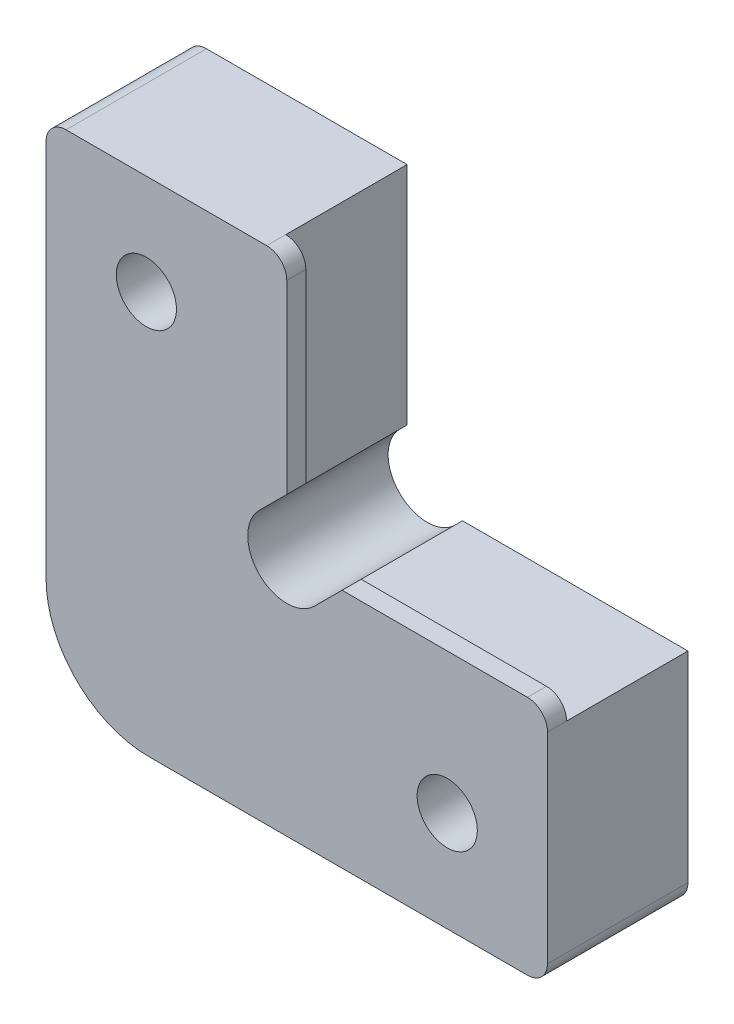
ISO-10303-21;
HEADER;
FILE_DESCRIPTION(('STEP AP214'),'2;1');
FILE_NAME('part.step','',(''),(''),'','','');
FILE_SCHEMA(('AUTOMOTIVE_DESIGN { 1 0 10303 214 1 1 1 1 }'));
ENDSEC;
DATA;
#1=APPLICATION_CONTEXT('core data for automotive mechanical design processes');
#2=APPLICATION_PROTOCOL_DEFINITION('international standard','automotive_design',2000,#1);
#3=PRODUCT_CONTEXT('',#1,'mechanical');
#4=PRODUCT('Part','Part','',(#3));
#5=PRODUCT_RELATED_PRODUCT_CATEGORY('part','',(#4));
#6=PRODUCT_DEFINITION_FORMATION('','',#4);
#7=PRODUCT_DEFINITION_CONTEXT('part definition',#1,'design');
#8=PRODUCT_DEFINITION('design','',#6,#7);
#9=PRODUCT_DEFINITION_SHAPE('','',#8);
#10=(LENGTH_UNIT() NAMED_UNIT(*) SI_UNIT(.MILLI.,.METRE.));
#11=(NAMED_UNIT(*) PLANE_ANGLE_UNIT() SI_UNIT($,.RADIAN.));
#12=(NAMED_UNIT(*) SI_UNIT($,.STERADIAN.) SOLID_ANGLE_UNIT());
#13=UNCERTAINTY_MEASURE_WITH_UNIT(LENGTH_MEASURE(1.E-05),#10,'distance_accuracy_value','');
#14=(GEOMETRIC_REPRESENTATION_CONTEXT(3) GLOBAL_UNCERTAINTY_ASSIGNED_CONTEXT((#13)) GLOBAL_UNIT_ASSIGNED_CONTEXT((#10,
#11,#12)) REPRESENTATION_CONTEXT('',''));
#15=CARTESIAN_POINT('',(0.,0.,0.));
#16=DIRECTION('',(0.,0.,1.));
#17=DIRECTION('',(1.,0.,0.));
#18=AXIS2_PLACEMENT_3D('',#15,#16,#17);
#19=CARTESIAN_POINT('',(14.,0.,7.));
#20=DIRECTION('',(0.,-1.,0.));
#21=DIRECTION('',(1.,0.,0.));
#22=AXIS2_PLACEMENT_3D('',#19,#20,#21);
#23=PLANE('',#22);
#24=DIRECTION('',(1.,0.,0.));
#25=VECTOR('',#24,1.);
#26=CARTESIAN_POINT('',(2.75771644662752,0.,6.05));
#27=LINE('',#26,#25);
#28=CARTESIAN_POINT('',(2.75771644662752,0.,6.05));
#29=VERTEX_POINT('',#28);
#30=CARTESIAN_POINT('',(14.,0.,6.05));
#31=VERTEX_POINT('',#30);
#32=EDGE_CURVE('E358',#29,#31,#27,.T.);
#33=ORIENTED_EDGE('',*,*,#32,.T.);
#34=DIRECTION('',(0.,0.,-1.));
#35=VECTOR('',#34,1.);
#36=CARTESIAN_POINT('',(14.,0.,7.));
#37=LINE('',#36,#35);
#38=CARTESIAN_POINT('',(14.,0.,0.));
#39=VERTEX_POINT('',#38);
#40=EDGE_CURVE('E203',#31,#39,#37,.T.);
#41=ORIENTED_EDGE('',*,*,#40,.T.);
#42=DIRECTION('',(-1.,0.,0.));
#43=VECTOR('',#42,1.);
#44=CARTESIAN_POINT('',(14.,0.,0.));
#45=LINE('',#44,#43);
#46=CARTESIAN_POINT('',(2.75771644662752,0.,0.));
#47=VERTEX_POINT('',#46);
#48=EDGE_CURVE('E253',#39,#47,#45,.T.);
#49=ORIENTED_EDGE('',*,*,#48,.T.);
#50=DIRECTION('',(0.,0.,-1.));
#51=VECTOR('',#50,1.);
#52=CARTESIAN_POINT('',(2.75771644662752,0.,7.));
#53=LINE('',#52,#51);
#54=EDGE_CURVE('E200',#29,#47,#53,.T.);
#55=ORIENTED_EDGE('',*,*,#54,.F.);
#56=EDGE_LOOP('',(#33,#41,#49,#55));
#57=FACE_BOUND('',#56,.T.);
#58=ADVANCED_FACE('F39',(#57),#23,.F.);
#59=CARTESIAN_POINT('',(-10.0037276247078,13.0037276247078,7.));
#60=DIRECTION('',(0.,0.,1.));
#61=DIRECTION('',(1.,0.,0.));
#62=AXIS2_PLACEMENT_3D('',#59,#60,#61);
#63=PLANE('',#62);
#64=CARTESIAN_POINT('',(8.99999999999997,-6.,7.));
#65=DIRECTION('',(0.,0.,1.));
#66=DIRECTION('',(1.,0.,0.));
#67=AXIS2_PLACEMENT_3D('',#64,#65,#66);
#68=CIRCLE('',#67,1.5);
#69=CARTESIAN_POINT('',(10.5,-6.,7.));
#70=VERTEX_POINT('',#69);
#71=EDGE_CURVE('E292',#70,#70,#68,.T.);
#72=ORIENTED_EDGE('',*,*,#71,.F.);
#73=EDGE_LOOP('',(#72));
#74=FACE_BOUND('',#73,.T.);
#75=CARTESIAN_POINT('',(-10.0037276247078,13.0037276247078,7.));
#76=DIRECTION('',(0.,0.,1.));
#77=DIRECTION('',(1.,0.,0.));
#78=AXIS2_PLACEMENT_3D('',#75,#76,#77);
#79=CIRCLE('',#78,0.996272375292206);
#80=CARTESIAN_POINT('',(-10.0037276247078,14.,7.));
#81=VERTEX_POINT('',#80);
#82=CARTESIAN_POINT('',(-11.,13.0037276247078,7.));
#83=VERTEX_POINT('',#82);
#84=EDGE_CURVE('E270',#81,#83,#79,.T.);
#85=ORIENTED_EDGE('',*,*,#84,.T.);
#86=DIRECTION('',(0.,-1.,0.));
#87=VECTOR('',#86,1.);
#88=CARTESIAN_POINT('',(-11.,13.0037276247078,7.));
#89=LINE('',#88,#87);
#90=CARTESIAN_POINT('',(-11.,-5.86775828744859,7.));
#91=VERTEX_POINT('',#90);
#92=EDGE_CURVE('E310',#83,#91,#89,.T.);
#93=ORIENTED_EDGE('',*,*,#92,.T.);
#94=CARTESIAN_POINT('',(-5.86775828744861,-5.86775828744859,7.));
#95=DIRECTION('',(0.,0.,1.));
#96=DIRECTION('',(1.,0.,0.));
#97=AXIS2_PLACEMENT_3D('',#94,#95,#96);
#98=CIRCLE('',#97,5.13224171255141);
#99=CARTESIAN_POINT('',(-5.86775828744861,-11.,7.));
#100=VERTEX_POINT('',#99);
#101=EDGE_CURVE('E227',#91,#100,#98,.T.);
#102=ORIENTED_EDGE('',*,*,#101,.T.);
#103=DIRECTION('',(1.,0.,0.));
#104=VECTOR('',#103,1.);
#105=CARTESIAN_POINT('',(-5.86775828744861,-11.,7.));
#106=LINE('',#105,#104);
#107=CARTESIAN_POINT('',(13.0037276247078,-11.,7.));
#108=VERTEX_POINT('',#107);
#109=EDGE_CURVE('E315',#100,#108,#106,.T.);
#110=ORIENTED_EDGE('',*,*,#109,.T.);
#111=CARTESIAN_POINT('',(13.0037276247078,-10.0037276247079,7.));
#112=DIRECTION('',(0.,0.,1.));
#113=DIRECTION('',(1.,0.,0.));
#114=AXIS2_PLACEMENT_3D('',#111,#112,#113);
#115=CIRCLE('',#114,0.996272375292165);
#116=CARTESIAN_POINT('',(13.9999999999999,-10.0037276247079,7.));
#117=VERTEX_POINT('',#116);
#118=EDGE_CURVE('E318',#108,#117,#115,.T.);
#119=ORIENTED_EDGE('',*,*,#118,.T.);
#120=DIRECTION('',(0.,1.,0.));
#121=VECTOR('',#120,1.);
#122=CARTESIAN_POINT('',(13.9999999999999,-10.0037276247079,7.));
#123=LINE('',#122,#121);
#124=CARTESIAN_POINT('',(14.,0.,7.));
#125=VERTEX_POINT('',#124);
#126=EDGE_CURVE('E321',#117,#125,#123,.T.);
#127=ORIENTED_EDGE('',*,*,#126,.T.);
#128=CARTESIAN_POINT('',(13.,0.,7.));
#129=DIRECTION('',(0.,0.,1.));
#130=DIRECTION('',(1.,0.,0.));
#131=AXIS2_PLACEMENT_3D('',#128,#129,#130);
#132=CIRCLE('',#131,0.999999999999992);
#133=CARTESIAN_POINT('',(13.,0.99999999999999,7.));
#134=VERTEX_POINT('',#133);
#135=EDGE_CURVE('E356',#125,#134,#132,.T.);
#136=ORIENTED_EDGE('',*,*,#135,.T.);
#137=DIRECTION('',(-1.,0.,0.));
#138=VECTOR('',#137,1.);
#139=CARTESIAN_POINT('',(3.75771644662751,0.999999999999989,7.));
#140=LINE('',#139,#138);
#141=CARTESIAN_POINT('',(3.75771644662751,0.999999999999989,7.));
#142=VERTEX_POINT('',#141);
#143=EDGE_CURVE('E363',#134,#142,#140,.T.);
#144=ORIENTED_EDGE('',*,*,#143,.T.);
#145=DIRECTION('',(-0.707106781186558,-0.707106781186538,0.));
#146=VECTOR('',#145,1.);
#147=CARTESIAN_POINT('',(2.38259271885182,-0.375123727775688,7.));
#148=LINE('',#147,#146);
#149=CARTESIAN_POINT('',(2.38259271885182,-0.375123727775688,7.));
#150=VERTEX_POINT('',#149);
#151=EDGE_CURVE('E325',#142,#150,#148,.T.);
#152=ORIENTED_EDGE('',*,*,#151,.T.);
#153=CARTESIAN_POINT('',(1.00373449553806,1.00373449553808,7.));
#154=DIRECTION('',(0.,0.,-1.));
#155=DIRECTION('',(1.,0.,0.));
#156=AXIS2_PLACEMENT_3D('',#153,#154,#155);
#157=CIRCLE('',#156,1.95);
#158=CARTESIAN_POINT('',(-0.375123727775707,2.38259271885185,7.));
#159=VERTEX_POINT('',#158);
#160=EDGE_CURVE('E288',#150,#159,#157,.T.);
#161=ORIENTED_EDGE('',*,*,#160,.T.);
#162=DIRECTION('',(0.707106781186557,0.707106781186538,0.));
#163=VECTOR('',#162,1.);
#164=CARTESIAN_POINT('',(0.,2.75771644662755,7.));
#165=LINE('',#164,#163);
#166=CARTESIAN_POINT('',(0.999999999999987,3.75771644662754,7.));
#167=VERTEX_POINT('',#166);
#168=EDGE_CURVE('E281',#159,#167,#165,.T.);
#169=ORIENTED_EDGE('',*,*,#168,.T.);
#170=DIRECTION('',(0.,1.,0.));
#171=VECTOR('',#170,1.);
#172=CARTESIAN_POINT('',(0.999999999999987,3.75771644662754,7.));
#173=LINE('',#172,#171);
#174=CARTESIAN_POINT('',(0.999999999999987,13.,7.));
#175=VERTEX_POINT('',#174);
#176=EDGE_CURVE('E345',#167,#175,#173,.T.);
#177=ORIENTED_EDGE('',*,*,#176,.T.);
#178=CARTESIAN_POINT('',(0.,13.,7.));
#179=DIRECTION('',(0.,0.,1.));
#180=DIRECTION('',(-1.,0.,0.));
#181=AXIS2_PLACEMENT_3D('',#178,#179,#180);
#182=CIRCLE('',#181,0.999999999999987);
#183=CARTESIAN_POINT('',(0.,14.,7.));
#184=VERTEX_POINT('',#183);
#185=EDGE_CURVE('E179',#175,#184,#182,.T.);
#186=ORIENTED_EDGE('',*,*,#185,.T.);
#187=DIRECTION('',(-1.,0.,0.));
#188=VECTOR('',#187,1.);
#189=CARTESIAN_POINT('',(-10.0037276247078,14.,7.));
#190=LINE('',#189,#188);
#191=EDGE_CURVE('E274',#184,#81,#190,.T.);
#192=ORIENTED_EDGE('',*,*,#191,.T.);
#193=EDGE_LOOP('',(#85,#93,#102,#110,#119,#127,#136,#144,#152,#161,#169,#177,#186,#192));
#194=FACE_BOUND('',#193,.T.);
#195=CARTESIAN_POINT('',(-6.00000000000001,9.,7.));
#196=DIRECTION('',(0.,0.,1.));
#197=DIRECTION('',(1.,0.,0.));
#198=AXIS2_PLACEMENT_3D('',#195,#196,#197);
#199=CIRCLE('',#198,1.5);
#200=CARTESIAN_POINT('',(-4.50000000000001,9.,7.));
#201=VERTEX_POINT('',#200);
#202=EDGE_CURVE('E302',#201,#201,#199,.T.);
#203=ORIENTED_EDGE('',*,*,#202,.F.);
#204=EDGE_LOOP('',(#203));
#205=FACE_BOUND('',#204,.T.);
#206=ADVANCED_FACE('F330',(#74,#194,#205),#63,.T.);
#207=CARTESIAN_POINT('',(-10.0037276247078,13.0037276247078,0.));
#208=DIRECTION('',(0.,0.,1.));
#209=DIRECTION('',(1.,0.,0.));
#210=AXIS2_PLACEMENT_3D('',#207,#208,#209);
#211=PLANE('',#210);
#212=CARTESIAN_POINT('',(-10.0037276247078,13.0037276247078,0.));
#213=DIRECTION('',(0.,0.,1.));
#214=DIRECTION('',(1.,0.,0.));
#215=AXIS2_PLACEMENT_3D('',#212,#213,#214);
#216=CIRCLE('',#215,0.996272375292206);
#217=CARTESIAN_POINT('',(-10.0037276247078,14.,0.));
#218=VERTEX_POINT('',#217);
#219=CARTESIAN_POINT('',(-11.,13.0037276247078,0.));
#220=VERTEX_POINT('',#219);
#221=EDGE_CURVE('E243',#218,#220,#216,.T.);
#222=ORIENTED_EDGE('',*,*,#221,.F.);
#223=DIRECTION('',(-1.,0.,0.));
#224=VECTOR('',#223,1.);
#225=CARTESIAN_POINT('',(-10.0037276247078,14.,0.));
#226=LINE('',#225,#224);
#227=CARTESIAN_POINT('',(0.,14.,0.));
#228=VERTEX_POINT('',#227);
#229=EDGE_CURVE('E268',#228,#218,#226,.T.);
#230=ORIENTED_EDGE('',*,*,#229,.F.);
#231=DIRECTION('',(0.,1.,0.));
#232=VECTOR('',#231,1.);
#233=CARTESIAN_POINT('',(0.,2.75771644662755,0.));
#234=LINE('',#233,#232);
#235=CARTESIAN_POINT('',(0.,2.75771644662755,0.));
#236=VERTEX_POINT('',#235);
#237=EDGE_CURVE('E265',#236,#228,#234,.T.);
#238=ORIENTED_EDGE('',*,*,#237,.F.);
#239=DIRECTION('',(0.707106781186557,0.707106781186538,0.));
#240=VECTOR('',#239,1.);
#241=CARTESIAN_POINT('',(0.,2.75771644662755,0.));
#242=LINE('',#241,#240);
#243=CARTESIAN_POINT('',(-0.375123727775707,2.38259271885185,0.));
#244=VERTEX_POINT('',#243);
#245=EDGE_CURVE('E184',#244,#236,#242,.T.);
#246=ORIENTED_EDGE('',*,*,#245,.F.);
#247=CARTESIAN_POINT('',(1.00373449553806,1.00373449553808,0.));
#248=DIRECTION('',(0.,0.,-1.));
#249=DIRECTION('',(1.,0.,0.));
#250=AXIS2_PLACEMENT_3D('',#247,#248,#249);
#251=CIRCLE('',#250,1.95);
#252=CARTESIAN_POINT('',(2.38259271885182,-0.375123727775688,0.));
#253=VERTEX_POINT('',#252);
#254=EDGE_CURVE('E260',#253,#244,#251,.T.);
#255=ORIENTED_EDGE('',*,*,#254,.F.);
#256=DIRECTION('',(-0.707106781186558,-0.707106781186538,0.));
#257=VECTOR('',#256,1.);
#258=CARTESIAN_POINT('',(2.38259271885182,-0.375123727775688,0.));
#259=LINE('',#258,#257);
#260=EDGE_CURVE('E257',#47,#253,#259,.T.);
#261=ORIENTED_EDGE('',*,*,#260,.F.);
#262=ORIENTED_EDGE('',*,*,#48,.F.);
#263=DIRECTION('',(0.,1.,0.));
#264=VECTOR('',#263,1.);
#265=CARTESIAN_POINT('',(13.9999999999999,-10.0037276247079,0.));
#266=LINE('',#265,#264);
#267=CARTESIAN_POINT('',(13.9999999999999,-10.0037276247079,0.));
#268=VERTEX_POINT('',#267);
#269=EDGE_CURVE('E249',#268,#39,#266,.T.);
#270=ORIENTED_EDGE('',*,*,#269,.F.);
#271=CARTESIAN_POINT('',(13.0037276247078,-10.0037276247079,0.));
#272=DIRECTION('',(0.,0.,1.));
#273=DIRECTION('',(1.,0.,0.));
#274=AXIS2_PLACEMENT_3D('',#271,#272,#273);
#275=CIRCLE('',#274,0.996272375292165);
#276=CARTESIAN_POINT('',(13.0037276247078,-11.,0.));
#277=VERTEX_POINT('',#276);
#278=EDGE_CURVE('E241',#277,#268,#275,.T.);
#279=ORIENTED_EDGE('',*,*,#278,.F.);
#280=DIRECTION('',(1.,0.,0.));
#281=VECTOR('',#280,1.);
#282=CARTESIAN_POINT('',(-5.86775828744861,-11.,0.));
#283=LINE('',#282,#281);
#284=CARTESIAN_POINT('',(-5.86775828744861,-11.,0.));
#285=VERTEX_POINT('',#284);
#286=EDGE_CURVE('E236',#285,#277,#283,.T.);
#287=ORIENTED_EDGE('',*,*,#286,.F.);
#288=CARTESIAN_POINT('',(-5.86775828744861,-5.86775828744859,0.));
#289=DIRECTION('',(0.,0.,1.));
#290=DIRECTION('',(1.,0.,0.));
#291=AXIS2_PLACEMENT_3D('',#288,#289,#290);
#292=CIRCLE('',#291,5.13224171255141);
#293=CARTESIAN_POINT('',(-11.,-5.86775828744859,0.));
#294=VERTEX_POINT('',#293);
#295=EDGE_CURVE('E226',#294,#285,#292,.T.);
#296=ORIENTED_EDGE('',*,*,#295,.F.);
#297=DIRECTION('',(0.,-1.,0.));
#298=VECTOR('',#297,1.);
#299=CARTESIAN_POINT('',(-11.,13.0037276247078,0.));
#300=LINE('',#299,#298);
#301=EDGE_CURVE('E234',#220,#294,#300,.T.);
#302=ORIENTED_EDGE('',*,*,#301,.F.);
#303=EDGE_LOOP('',(#222,#230,#238,#246,#255,#261,#262,#270,#279,#287,#296,#302));
#304=FACE_BOUND('',#303,.T.);
#305=CARTESIAN_POINT('',(8.99999999999997,-6.,0.));
#306=DIRECTION('',(0.,0.,1.));
#307=DIRECTION('',(1.,0.,0.));
#308=AXIS2_PLACEMENT_3D('',#305,#306,#307);
#309=CIRCLE('',#308,1.5);
#310=CARTESIAN_POINT('',(10.5,-6.,0.));
#311=VERTEX_POINT('',#310);
#312=EDGE_CURVE('E296',#311,#311,#309,.T.);
#313=ORIENTED_EDGE('',*,*,#312,.T.);
#314=EDGE_LOOP('',(#313));
#315=FACE_BOUND('',#314,.T.);
#316=CARTESIAN_POINT('',(-6.00000000000001,9.,0.));
#317=DIRECTION('',(0.,0.,1.));
#318=DIRECTION('',(1.,0.,0.));
#319=AXIS2_PLACEMENT_3D('',#316,#317,#318);
#320=CIRCLE('',#319,1.5);
#321=CARTESIAN_POINT('',(-4.50000000000001,9.,0.));
#322=VERTEX_POINT('',#321);
#323=EDGE_CURVE('E305',#322,#322,#320,.T.);
#324=ORIENTED_EDGE('',*,*,#323,.T.);
#325=EDGE_LOOP('',(#324));
#326=FACE_BOUND('',#325,.T.);
#327=ADVANCED_FACE('F232',(#304,#315,#326),#211,.F.);
#328=CARTESIAN_POINT('',(-10.0037276247078,13.0037276247078,7.));
#329=DIRECTION('',(0.,0.,-1.));
#330=DIRECTION('',(-1.,0.,0.));
#331=AXIS2_PLACEMENT_3D('',#328,#329,#330);
#332=CYLINDRICAL_SURFACE('',#331,0.996272375292206);
#333=ORIENTED_EDGE('',*,*,#221,.T.);
#334=DIRECTION('',(0.,0.,-1.));
#335=VECTOR('',#334,1.);
#336=CARTESIAN_POINT('',(-11.,13.0037276247078,7.));
#337=LINE('',#336,#335);
#338=EDGE_CURVE('E11',#83,#220,#337,.T.);
#339=ORIENTED_EDGE('',*,*,#338,.F.);
#340=ORIENTED_EDGE('',*,*,#84,.F.);
#341=DIRECTION('',(0.,0.,-1.));
#342=VECTOR('',#341,1.);
#343=CARTESIAN_POINT('',(-10.0037276247078,14.,7.));
#344=LINE('',#343,#342);
#345=EDGE_CURVE('E271',#81,#218,#344,.T.);
#346=ORIENTED_EDGE('',*,*,#345,.T.);
#347=EDGE_LOOP('',(#333,#339,#340,#346));
#348=FACE_BOUND('',#347,.T.);
#349=ADVANCED_FACE('F41',(#348),#332,.T.);
#350=CARTESIAN_POINT('',(-11.,13.0037276247078,7.));
#351=DIRECTION('',(1.,0.,0.));
#352=DIRECTION('',(0.,1.,0.));
#353=AXIS2_PLACEMENT_3D('',#350,#351,#352);
#354=PLANE('',#353);
#355=ORIENTED_EDGE('',*,*,#301,.T.);
#356=DIRECTION('',(0.,0.,-1.));
#357=VECTOR('',#356,1.);
#358=CARTESIAN_POINT('',(-11.,-5.86775828744859,7.));
#359=LINE('',#358,#357);
#360=EDGE_CURVE('E48',#91,#294,#359,.T.);
#361=ORIENTED_EDGE('',*,*,#360,.F.);
#362=ORIENTED_EDGE('',*,*,#92,.F.);
#363=ORIENTED_EDGE('',*,*,#338,.T.);
#364=EDGE_LOOP('',(#355,#361,#362,#363));
#365=FACE_BOUND('',#364,.T.);
#366=ADVANCED_FACE('F433',(#365),#354,.F.);
#367=CARTESIAN_POINT('',(-5.86775828744861,-5.86775828744859,7.));
#368=DIRECTION('',(0.,0.,-1.));
#369=DIRECTION('',(-1.,0.,0.));
#370=AXIS2_PLACEMENT_3D('',#367,#368,#369);
#371=CYLINDRICAL_SURFACE('',#370,5.13224171255141);
#372=ORIENTED_EDGE('',*,*,#295,.T.);
#373=DIRECTION('',(0.,0.,-1.));
#374=VECTOR('',#373,1.);
#375=CARTESIAN_POINT('',(-5.86775828744861,-11.,7.));
#376=LINE('',#375,#374);
#377=EDGE_CURVE('E215',#100,#285,#376,.T.);
#378=ORIENTED_EDGE('',*,*,#377,.F.);
#379=ORIENTED_EDGE('',*,*,#101,.F.);
#380=ORIENTED_EDGE('',*,*,#360,.T.);
#381=EDGE_LOOP('',(#372,#378,#379,#380));
#382=FACE_BOUND('',#381,.T.);
#383=ADVANCED_FACE('F224',(#382),#371,.T.);
#384=CARTESIAN_POINT('',(-5.86775828744861,-11.,7.));
#385=DIRECTION('',(0.,1.,0.));
#386=DIRECTION('',(-1.,0.,0.));
#387=AXIS2_PLACEMENT_3D('',#384,#385,#386);
#388=PLANE('',#387);
#389=ORIENTED_EDGE('',*,*,#286,.T.);
#390=DIRECTION('',(0.,0.,-1.));
#391=VECTOR('',#390,1.);
#392=CARTESIAN_POINT('',(13.0037276247078,-11.,7.));
#393=LINE('',#392,#391);
#394=EDGE_CURVE('E211',#108,#277,#393,.T.);
#395=ORIENTED_EDGE('',*,*,#394,.F.);
#396=ORIENTED_EDGE('',*,*,#109,.F.);
#397=ORIENTED_EDGE('',*,*,#377,.T.);
#398=EDGE_LOOP('',(#389,#395,#396,#397));
#399=FACE_BOUND('',#398,.T.);
#400=ADVANCED_FACE('F427',(#399),#388,.F.);
#401=CARTESIAN_POINT('',(13.0037276247078,-10.0037276247079,7.));
#402=DIRECTION('',(0.,0.,-1.));
#403=DIRECTION('',(-1.,0.,0.));
#404=AXIS2_PLACEMENT_3D('',#401,#402,#403);
#405=CYLINDRICAL_SURFACE('',#404,0.996272375292165);
#406=ORIENTED_EDGE('',*,*,#278,.T.);
#407=DIRECTION('',(0.,0.,-1.));
#408=VECTOR('',#407,1.);
#409=CARTESIAN_POINT('',(13.9999999999999,-10.0037276247079,7.));
#410=LINE('',#409,#408);
#411=EDGE_CURVE('E207',#117,#268,#410,.T.);
#412=ORIENTED_EDGE('',*,*,#411,.F.);
#413=ORIENTED_EDGE('',*,*,#118,.F.);
#414=ORIENTED_EDGE('',*,*,#394,.T.);
#415=EDGE_LOOP('',(#406,#412,#413,#414));
#416=FACE_BOUND('',#415,.T.);
#417=ADVANCED_FACE('F423',(#416),#405,.T.);
#418=CARTESIAN_POINT('',(13.9999999999999,-10.0037276247079,7.));
#419=DIRECTION('',(-1.,0.,0.));
#420=DIRECTION('',(0.,-1.,0.));
#421=AXIS2_PLACEMENT_3D('',#418,#419,#420);
#422=PLANE('',#421);
#423=ORIENTED_EDGE('',*,*,#269,.T.);
#424=ORIENTED_EDGE('',*,*,#40,.F.);
#425=EDGE_CURVE('E204',#125,#31,#37,.T.);
#426=ORIENTED_EDGE('',*,*,#425,.F.);
#427=ORIENTED_EDGE('',*,*,#126,.F.);
#428=ORIENTED_EDGE('',*,*,#411,.T.);
#429=EDGE_LOOP('',(#423,#424,#426,#427,#428));
#430=FACE_BOUND('',#429,.T.);
#431=ADVANCED_FACE('F420',(#430),#422,.F.);
#432=CARTESIAN_POINT('',(2.38259271885182,-0.375123727775688,7.));
#433=DIRECTION('',(0.707106781186538,-0.707106781186558,0.));
#434=DIRECTION('',(0.707106781186558,0.707106781186538,0.));
#435=AXIS2_PLACEMENT_3D('',#432,#433,#434);
#436=PLANE('',#435);
#437=ORIENTED_EDGE('',*,*,#260,.T.);
#438=DIRECTION('',(0.,0.,-1.));
#439=VECTOR('',#438,1.);
#440=CARTESIAN_POINT('',(2.38259271885182,-0.375123727775688,7.));
#441=LINE('',#440,#439);
#442=EDGE_CURVE('E192',#150,#253,#441,.T.);
#443=ORIENTED_EDGE('',*,*,#442,.F.);
#444=ORIENTED_EDGE('',*,*,#151,.F.);
#445=DIRECTION('',(0.,0.,1.));
#446=VECTOR('',#445,1.);
#447=CARTESIAN_POINT('',(3.75771644662751,0.999999999999989,6.05));
#448=LINE('',#447,#446);
#449=CARTESIAN_POINT('',(3.75771644662751,0.999999999999989,6.05));
#450=VERTEX_POINT('',#449);
#451=EDGE_CURVE('E379',#450,#142,#448,.T.);
#452=ORIENTED_EDGE('',*,*,#451,.F.);
#453=DIRECTION('',(-0.707106781186548,-0.707106781186548,0.));
#454=VECTOR('',#453,1.);
#455=CARTESIAN_POINT('',(2.75771644662752,0.,6.05));
#456=LINE('',#455,#454);
#457=EDGE_CURVE('E63',#450,#29,#456,.T.);
#458=ORIENTED_EDGE('',*,*,#457,.T.);
#459=ORIENTED_EDGE('',*,*,#54,.T.);
#460=EDGE_LOOP('',(#437,#443,#444,#452,#458,#459));
#461=FACE_BOUND('',#460,.T.);
#462=ADVANCED_FACE('F418',(#461),#436,.F.);
#463=CARTESIAN_POINT('',(1.00373449553806,1.00373449553808,7.));
#464=DIRECTION('',(0.,0.,-1.));
#465=DIRECTION('',(-1.,0.,0.));
#466=AXIS2_PLACEMENT_3D('',#463,#464,#465);
#467=CYLINDRICAL_SURFACE('',#466,1.95);
#468=ORIENTED_EDGE('',*,*,#254,.T.);
#469=DIRECTION('',(0.,0.,-1.));
#470=VECTOR('',#469,1.);
#471=CARTESIAN_POINT('',(-0.375123727775707,2.38259271885185,7.));
#472=LINE('',#471,#470);
#473=EDGE_CURVE('E187',#159,#244,#472,.T.);
#474=ORIENTED_EDGE('',*,*,#473,.F.);
#475=ORIENTED_EDGE('',*,*,#160,.F.);
#476=ORIENTED_EDGE('',*,*,#442,.T.);
#477=EDGE_LOOP('',(#468,#474,#475,#476));
#478=FACE_BOUND('',#477,.T.);
#479=ADVANCED_FACE('F337',(#478),#467,.F.);
#480=CARTESIAN_POINT('',(0.,2.75771644662755,7.));
#481=DIRECTION('',(-0.707106781186538,0.707106781186557,0.));
#482=DIRECTION('',(-0.707106781186557,-0.707106781186538,0.));
#483=AXIS2_PLACEMENT_3D('',#480,#481,#482);
#484=PLANE('',#483);
#485=ORIENTED_EDGE('',*,*,#245,.T.);
#486=DIRECTION('',(0.,0.,-1.));
#487=VECTOR('',#486,1.);
#488=CARTESIAN_POINT('',(0.,2.75771644662755,7.));
#489=LINE('',#488,#487);
#490=CARTESIAN_POINT('',(0.,2.75771644662755,6.05));
#491=VERTEX_POINT('',#490);
#492=EDGE_CURVE('E174',#491,#236,#489,.T.);
#493=ORIENTED_EDGE('',*,*,#492,.F.);
#494=DIRECTION('',(0.707106781186546,0.707106781186549,0.));
#495=VECTOR('',#494,1.);
#496=CARTESIAN_POINT('',(0.,2.75771644662755,6.05));
#497=LINE('',#496,#495);
#498=CARTESIAN_POINT('',(0.999999999999987,3.75771644662754,6.05));
#499=VERTEX_POINT('',#498);
#500=EDGE_CURVE('E159',#491,#499,#497,.T.);
#501=ORIENTED_EDGE('',*,*,#500,.T.);
#502=DIRECTION('',(0.,0.,1.));
#503=VECTOR('',#502,1.);
#504=CARTESIAN_POINT('',(0.999999999999987,3.75771644662754,6.05));
#505=LINE('',#504,#503);
#506=EDGE_CURVE('E339',#499,#167,#505,.T.);
#507=ORIENTED_EDGE('',*,*,#506,.T.);
#508=ORIENTED_EDGE('',*,*,#168,.F.);
#509=ORIENTED_EDGE('',*,*,#473,.T.);
#510=EDGE_LOOP('',(#485,#493,#501,#507,#508,#509));
#511=FACE_BOUND('',#510,.T.);
#512=ADVANCED_FACE('F181',(#511),#484,.F.);
#513=CARTESIAN_POINT('',(0.,2.75771644662755,7.));
#514=DIRECTION('',(-1.,0.,0.));
#515=DIRECTION('',(0.,-1.,0.));
#516=AXIS2_PLACEMENT_3D('',#513,#514,#515);
#517=PLANE('',#516);
#518=DIRECTION('',(0.,0.,-1.));
#519=VECTOR('',#518,1.);
#520=CARTESIAN_POINT('',(0.,14.,7.));
#521=LINE('',#520,#519);
#522=CARTESIAN_POINT('',(0.,14.,6.05));
#523=VERTEX_POINT('',#522);
#524=EDGE_CURVE('E176',#523,#228,#521,.T.);
#525=ORIENTED_EDGE('',*,*,#524,.F.);
#526=DIRECTION('',(0.,-1.,0.));
#527=VECTOR('',#526,1.);
#528=CARTESIAN_POINT('',(0.,14.,6.05));
#529=LINE('',#528,#527);
#530=EDGE_CURVE('E162',#523,#491,#529,.T.);
#531=ORIENTED_EDGE('',*,*,#530,.T.);
#532=ORIENTED_EDGE('',*,*,#492,.T.);
#533=ORIENTED_EDGE('',*,*,#237,.T.);
#534=EDGE_LOOP('',(#525,#531,#532,#533));
#535=FACE_BOUND('',#534,.T.);
#536=ADVANCED_FACE('F172',(#535),#517,.F.);
#537=CARTESIAN_POINT('',(-10.0037276247078,14.,7.));
#538=DIRECTION('',(0.,-1.,0.));
#539=DIRECTION('',(1.,0.,0.));
#540=AXIS2_PLACEMENT_3D('',#537,#538,#539);
#541=PLANE('',#540);
#542=ORIENTED_EDGE('',*,*,#229,.T.);
#543=ORIENTED_EDGE('',*,*,#345,.F.);
#544=ORIENTED_EDGE('',*,*,#191,.F.);
#545=EDGE_CURVE('E188',#184,#523,#521,.T.);
#546=ORIENTED_EDGE('',*,*,#545,.T.);
#547=ORIENTED_EDGE('',*,*,#524,.T.);
#548=EDGE_LOOP('',(#542,#543,#544,#546,#547));
#549=FACE_BOUND('',#548,.T.);
#550=ADVANCED_FACE('F405',(#549),#541,.F.);
#551=CARTESIAN_POINT('',(8.99999999999997,-6.,7.));
#552=DIRECTION('',(0.,0.,-1.));
#553=DIRECTION('',(-1.,0.,0.));
#554=AXIS2_PLACEMENT_3D('',#551,#552,#553);
#555=CYLINDRICAL_SURFACE('',#554,1.5);
#556=ORIENTED_EDGE('',*,*,#71,.T.);
#557=EDGE_LOOP('',(#556));
#558=FACE_BOUND('',#557,.T.);
#559=ORIENTED_EDGE('',*,*,#312,.F.);
#560=EDGE_LOOP('',(#559));
#561=FACE_BOUND('',#560,.T.);
#562=ADVANCED_FACE('F396',(#558,#561),#555,.F.);
#563=CARTESIAN_POINT('',(-6.00000000000001,9.,7.));
#564=DIRECTION('',(0.,0.,-1.));
#565=DIRECTION('',(-1.,0.,0.));
#566=AXIS2_PLACEMENT_3D('',#563,#564,#565);
#567=CYLINDRICAL_SURFACE('',#566,1.5);
#568=ORIENTED_EDGE('',*,*,#202,.T.);
#569=EDGE_LOOP('',(#568));
#570=FACE_BOUND('',#569,.T.);
#571=ORIENTED_EDGE('',*,*,#323,.F.);
#572=EDGE_LOOP('',(#571));
#573=FACE_BOUND('',#572,.T.);
#574=ADVANCED_FACE('F393',(#570,#573),#567,.F.);
#575=CARTESIAN_POINT('',(3.75771644662751,0.999999999999989,6.05));
#576=DIRECTION('',(0.,1.,0.));
#577=DIRECTION('',(-1.,0.,0.));
#578=AXIS2_PLACEMENT_3D('',#575,#576,#577);
#579=PLANE('',#578);
#580=ORIENTED_EDGE('',*,*,#143,.F.);
#581=DIRECTION('',(0.,0.,1.));
#582=VECTOR('',#581,1.);
#583=CARTESIAN_POINT('',(13.,0.99999999999999,6.05));
#584=LINE('',#583,#582);
#585=CARTESIAN_POINT('',(13.,0.99999999999999,6.05));
#586=VERTEX_POINT('',#585);
#587=EDGE_CURVE('E373',#586,#134,#584,.T.);
#588=ORIENTED_EDGE('',*,*,#587,.F.);
#589=DIRECTION('',(-1.,0.,0.));
#590=VECTOR('',#589,1.);
#591=CARTESIAN_POINT('',(3.75771644662751,0.999999999999989,6.05));
#592=LINE('',#591,#590);
#593=EDGE_CURVE('E367',#586,#450,#592,.T.);
#594=ORIENTED_EDGE('',*,*,#593,.T.);
#595=ORIENTED_EDGE('',*,*,#451,.T.);
#596=EDGE_LOOP('',(#580,#588,#594,#595));
#597=FACE_BOUND('',#596,.T.);
#598=ADVANCED_FACE('F395',(#597),#579,.T.);
#599=CARTESIAN_POINT('',(13.,0.,6.05));
#600=DIRECTION('',(0.,0.,1.));
#601=DIRECTION('',(1.,0.,0.));
#602=AXIS2_PLACEMENT_3D('',#599,#600,#601);
#603=CYLINDRICAL_SURFACE('',#602,0.999999999999992);
#604=ORIENTED_EDGE('',*,*,#135,.F.);
#605=ORIENTED_EDGE('',*,*,#425,.T.);
#606=CARTESIAN_POINT('',(13.,0.,6.05));
#607=DIRECTION('',(0.,0.,1.));
#608=DIRECTION('',(1.,0.,0.));
#609=AXIS2_PLACEMENT_3D('',#606,#607,#608);
#610=CIRCLE('',#609,0.999999999999992);
#611=EDGE_CURVE('E362',#31,#586,#610,.T.);
#612=ORIENTED_EDGE('',*,*,#611,.T.);
#613=ORIENTED_EDGE('',*,*,#587,.T.);
#614=EDGE_LOOP('',(#604,#605,#612,#613));
#615=FACE_BOUND('',#614,.T.);
#616=ADVANCED_FACE('F402',(#615),#603,.T.);
#617=CARTESIAN_POINT('',(13.,0.,6.05));
#618=DIRECTION('',(0.,0.,1.));
#619=DIRECTION('',(1.,0.,0.));
#620=AXIS2_PLACEMENT_3D('',#617,#618,#619);
#621=PLANE('',#620);
#622=ORIENTED_EDGE('',*,*,#32,.F.);
#623=ORIENTED_EDGE('',*,*,#457,.F.);
#624=ORIENTED_EDGE('',*,*,#593,.F.);
#625=ORIENTED_EDGE('',*,*,#611,.F.);
#626=EDGE_LOOP('',(#622,#623,#624,#625));
#627=FACE_BOUND('',#626,.T.);
#628=ADVANCED_FACE('F449',(#627),#621,.F.);
#629=CARTESIAN_POINT('',(0.,13.,6.05));
#630=DIRECTION('',(0.,0.,1.));
#631=DIRECTION('',(1.,0.,0.));
#632=AXIS2_PLACEMENT_3D('',#629,#630,#631);
#633=CYLINDRICAL_SURFACE('',#632,0.999999999999987);
#634=ORIENTED_EDGE('',*,*,#185,.F.);
#635=DIRECTION('',(0.,0.,1.));
#636=VECTOR('',#635,1.);
#637=CARTESIAN_POINT('',(0.999999999999987,13.,6.05));
#638=LINE('',#637,#636);
#639=CARTESIAN_POINT('',(0.999999999999987,13.,6.05));
#640=VERTEX_POINT('',#639);
#641=EDGE_CURVE('E343',#640,#175,#638,.T.);
#642=ORIENTED_EDGE('',*,*,#641,.F.);
#643=CARTESIAN_POINT('',(0.,13.,6.05));
#644=DIRECTION('',(0.,0.,1.));
#645=DIRECTION('',(-1.,0.,0.));
#646=AXIS2_PLACEMENT_3D('',#643,#644,#645);
#647=CIRCLE('',#646,0.999999999999987);
#648=EDGE_CURVE('E55',#640,#523,#647,.T.);
#649=ORIENTED_EDGE('',*,*,#648,.T.);
#650=ORIENTED_EDGE('',*,*,#545,.F.);
#651=EDGE_LOOP('',(#634,#642,#649,#650));
#652=FACE_BOUND('',#651,.T.);
#653=ADVANCED_FACE('F455',(#652),#633,.T.);
#654=CARTESIAN_POINT('',(0.999999999999987,3.75771644662754,6.05));
#655=DIRECTION('',(1.,0.,0.));
#656=DIRECTION('',(0.,0.,-1.));
#657=AXIS2_PLACEMENT_3D('',#654,#655,#656);
#658=PLANE('',#657);
#659=ORIENTED_EDGE('',*,*,#176,.F.);
#660=ORIENTED_EDGE('',*,*,#506,.F.);
#661=DIRECTION('',(0.,1.,0.));
#662=VECTOR('',#661,1.);
#663=CARTESIAN_POINT('',(0.999999999999987,3.75771644662754,6.05));
#664=LINE('',#663,#662);
#665=EDGE_CURVE('E165',#499,#640,#664,.T.);
#666=ORIENTED_EDGE('',*,*,#665,.T.);
#667=ORIENTED_EDGE('',*,*,#641,.T.);
#668=EDGE_LOOP('',(#659,#660,#666,#667));
#669=FACE_BOUND('',#668,.T.);
#670=ADVANCED_FACE('F346',(#669),#658,.T.);
#671=CARTESIAN_POINT('',(0.,13.,6.05));
#672=DIRECTION('',(0.,0.,-1.));
#673=DIRECTION('',(-1.,0.,0.));
#674=AXIS2_PLACEMENT_3D('',#671,#672,#673);
#675=PLANE('',#674);
#676=ORIENTED_EDGE('',*,*,#530,.F.);
#677=ORIENTED_EDGE('',*,*,#648,.F.);
#678=ORIENTED_EDGE('',*,*,#665,.F.);
#679=ORIENTED_EDGE('',*,*,#500,.F.);
#680=EDGE_LOOP('',(#676,#677,#678,#679));
#681=FACE_BOUND('',#680,.T.);
#682=ADVANCED_FACE('F161',(#681),#675,.T.);
#683=CLOSED_SHELL('',(#58,#206,#327,#349,#366,#383,#400,#417,#431,#462,#479,#512,#536,#550,#562,
#574,#598,#616,#628,#653,#670,#682));
#684=MANIFOLD_SOLID_BREP('B2',#683);
#685=ADVANCED_BREP_SHAPE_REPRESENTATION('',(#18,#684),#14);
#686=SHAPE_DEFINITION_REPRESENTATION(#9,#685);
ENDSEC;
END-ISO-10303-21;
